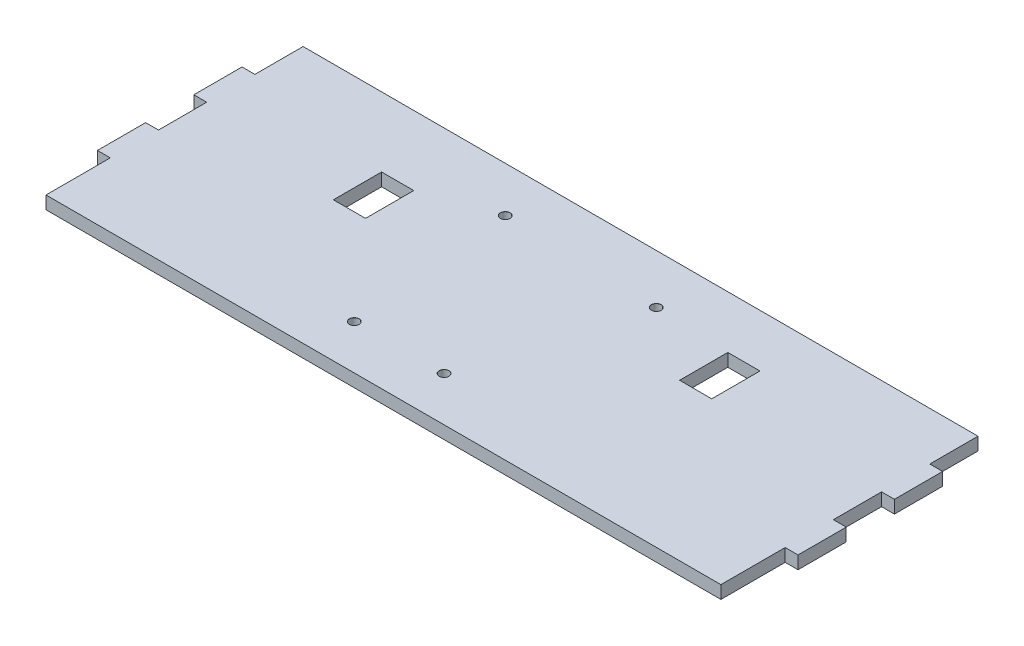
ISO-10303-21;
HEADER;
FILE_DESCRIPTION(('STEP AP214'),'2;1');
FILE_NAME('part.step','',(''),(''),'','','');
FILE_SCHEMA(('AUTOMOTIVE_DESIGN { 1 0 10303 214 1 1 1 1 }'));
ENDSEC;
DATA;
#1=APPLICATION_CONTEXT('core data for automotive mechanical design processes');
#2=APPLICATION_PROTOCOL_DEFINITION('international standard','automotive_design',2000,#1);
#3=PRODUCT_CONTEXT('',#1,'mechanical');
#4=PRODUCT('Part','Part','',(#3));
#5=PRODUCT_RELATED_PRODUCT_CATEGORY('part','',(#4));
#6=PRODUCT_DEFINITION_FORMATION('','',#4);
#7=PRODUCT_DEFINITION_CONTEXT('part definition',#1,'design');
#8=PRODUCT_DEFINITION('design','',#6,#7);
#9=PRODUCT_DEFINITION_SHAPE('','',#8);
#10=(LENGTH_UNIT() NAMED_UNIT(*) SI_UNIT(.MILLI.,.METRE.));
#11=(NAMED_UNIT(*) PLANE_ANGLE_UNIT() SI_UNIT($,.RADIAN.));
#12=(NAMED_UNIT(*) SI_UNIT($,.STERADIAN.) SOLID_ANGLE_UNIT());
#13=UNCERTAINTY_MEASURE_WITH_UNIT(LENGTH_MEASURE(1.E-05),#10,'distance_accuracy_value','');
#14=(GEOMETRIC_REPRESENTATION_CONTEXT(3) GLOBAL_UNCERTAINTY_ASSIGNED_CONTEXT((#13)) GLOBAL_UNIT_ASSIGNED_CONTEXT((#10,
#11,#12)) REPRESENTATION_CONTEXT('',''));
#15=CARTESIAN_POINT('',(0.,0.,0.));
#16=DIRECTION('',(0.,0.,1.));
#17=DIRECTION('',(1.,0.,0.));
#18=AXIS2_PLACEMENT_3D('',#15,#16,#17);
#19=CARTESIAN_POINT('',(210.,4.,0.));
#20=DIRECTION('',(-1.,0.,0.));
#21=DIRECTION('',(0.,0.,1.));
#22=AXIS2_PLACEMENT_3D('',#19,#20,#21);
#23=PLANE('',#22);
#24=DIRECTION('',(0.,1.,0.));
#25=VECTOR('',#24,1.);
#26=CARTESIAN_POINT('',(210.,3.99999999999979,-35.));
#27=LINE('',#26,#25);
#28=CARTESIAN_POINT('',(210.,-2.10173082171715E-13,-35.));
#29=VERTEX_POINT('',#28);
#30=CARTESIAN_POINT('',(210.,4.,-35.));
#31=VERTEX_POINT('',#30);
#32=EDGE_CURVE('E242',#29,#31,#27,.T.);
#33=ORIENTED_EDGE('',*,*,#32,.F.);
#34=DIRECTION('',(0.,0.,-1.));
#35=VECTOR('',#34,1.);
#36=CARTESIAN_POINT('',(210.,0.,0.));
#37=LINE('',#36,#35);
#38=CARTESIAN_POINT('',(210.,0.,-50.));
#39=VERTEX_POINT('',#38);
#40=EDGE_CURVE('E415',#29,#39,#37,.T.);
#41=ORIENTED_EDGE('',*,*,#40,.T.);
#42=DIRECTION('',(0.,-1.,0.));
#43=VECTOR('',#42,1.);
#44=CARTESIAN_POINT('',(210.,4.,-50.));
#45=LINE('',#44,#43);
#46=CARTESIAN_POINT('',(210.,4.,-50.));
#47=VERTEX_POINT('',#46);
#48=EDGE_CURVE('E246',#47,#39,#45,.T.);
#49=ORIENTED_EDGE('',*,*,#48,.F.);
#50=DIRECTION('',(0.,0.,-1.));
#51=VECTOR('',#50,1.);
#52=CARTESIAN_POINT('',(210.,4.,0.));
#53=LINE('',#52,#51);
#54=EDGE_CURVE('E48',#31,#47,#53,.T.);
#55=ORIENTED_EDGE('',*,*,#54,.F.);
#56=EDGE_LOOP('',(#33,#41,#49,#55));
#57=FACE_BOUND('',#56,.T.);
#58=ADVANCED_FACE('F33',(#57),#23,.F.);
#59=DIRECTION('',(0.,-1.,0.));
#60=VECTOR('',#59,1.);
#61=CARTESIAN_POINT('',(210.,3.99999999999979,-20.));
#62=LINE('',#61,#60);
#63=CARTESIAN_POINT('',(210.,4.,-20.));
#64=VERTEX_POINT('',#63);
#65=CARTESIAN_POINT('',(210.,0.,-20.));
#66=VERTEX_POINT('',#65);
#67=EDGE_CURVE('E56',#64,#66,#62,.T.);
#68=ORIENTED_EDGE('',*,*,#67,.F.);
#69=CARTESIAN_POINT('',(210.,4.,0.));
#70=VERTEX_POINT('',#69);
#71=EDGE_CURVE('E401',#70,#64,#53,.T.);
#72=ORIENTED_EDGE('',*,*,#71,.F.);
#73=DIRECTION('',(0.,-1.,0.));
#74=VECTOR('',#73,1.);
#75=CARTESIAN_POINT('',(210.,4.,0.));
#76=LINE('',#75,#74);
#77=CARTESIAN_POINT('',(210.,0.,0.));
#78=VERTEX_POINT('',#77);
#79=EDGE_CURVE('E41',#70,#78,#76,.T.);
#80=ORIENTED_EDGE('',*,*,#79,.T.);
#81=EDGE_CURVE('E412',#78,#66,#37,.T.);
#82=ORIENTED_EDGE('',*,*,#81,.T.);
#83=EDGE_LOOP('',(#68,#72,#80,#82));
#84=FACE_BOUND('',#83,.T.);
#85=ADVANCED_FACE('F424',(#84),#23,.F.);
#86=DIRECTION('',(0.,1.,0.));
#87=VECTOR('',#86,1.);
#88=CARTESIAN_POINT('',(210.,4.,-65.));
#89=LINE('',#88,#87);
#90=CARTESIAN_POINT('',(210.,0.,-65.));
#91=VERTEX_POINT('',#90);
#92=CARTESIAN_POINT('',(210.,4.,-65.));
#93=VERTEX_POINT('',#92);
#94=EDGE_CURVE('E243',#91,#93,#89,.T.);
#95=ORIENTED_EDGE('',*,*,#94,.F.);
#96=CARTESIAN_POINT('',(210.,0.,-80.));
#97=VERTEX_POINT('',#96);
#98=EDGE_CURVE('E411',#91,#97,#37,.T.);
#99=ORIENTED_EDGE('',*,*,#98,.T.);
#100=DIRECTION('',(0.,-1.,0.));
#101=VECTOR('',#100,1.);
#102=CARTESIAN_POINT('',(210.,4.,-80.));
#103=LINE('',#102,#101);
#104=CARTESIAN_POINT('',(210.,4.,-80.));
#105=VERTEX_POINT('',#104);
#106=EDGE_CURVE('E419',#105,#97,#103,.T.);
#107=ORIENTED_EDGE('',*,*,#106,.F.);
#108=EDGE_CURVE('E400',#93,#105,#53,.T.);
#109=ORIENTED_EDGE('',*,*,#108,.F.);
#110=EDGE_LOOP('',(#95,#99,#107,#109));
#111=FACE_BOUND('',#110,.T.);
#112=ADVANCED_FACE('F523',(#111),#23,.F.);
#113=CARTESIAN_POINT('',(0.,4.,0.));
#114=DIRECTION('',(1.,0.,0.));
#115=DIRECTION('',(0.,0.,-1.));
#116=AXIS2_PLACEMENT_3D('',#113,#114,#115);
#117=PLANE('',#116);
#118=DIRECTION('',(0.,-1.,0.));
#119=VECTOR('',#118,1.);
#120=CARTESIAN_POINT('',(0.,4.,-35.));
#121=LINE('',#120,#119);
#122=CARTESIAN_POINT('',(0.,4.,-35.));
#123=VERTEX_POINT('',#122);
#124=CARTESIAN_POINT('',(0.,0.,-35.));
#125=VERTEX_POINT('',#124);
#126=EDGE_CURVE('E275',#123,#125,#121,.T.);
#127=ORIENTED_EDGE('',*,*,#126,.F.);
#128=DIRECTION('',(0.,0.,1.));
#129=VECTOR('',#128,1.);
#130=CARTESIAN_POINT('',(0.,4.,0.));
#131=LINE('',#130,#129);
#132=CARTESIAN_POINT('',(0.,4.,-50.));
#133=VERTEX_POINT('',#132);
#134=EDGE_CURVE('E397',#133,#123,#131,.T.);
#135=ORIENTED_EDGE('',*,*,#134,.F.);
#136=DIRECTION('',(0.,1.,0.));
#137=VECTOR('',#136,1.);
#138=CARTESIAN_POINT('',(0.,4.,-50.));
#139=LINE('',#138,#137);
#140=CARTESIAN_POINT('',(0.,0.,-50.));
#141=VERTEX_POINT('',#140);
#142=EDGE_CURVE('E307',#141,#133,#139,.T.);
#143=ORIENTED_EDGE('',*,*,#142,.F.);
#144=DIRECTION('',(0.,0.,1.));
#145=VECTOR('',#144,1.);
#146=CARTESIAN_POINT('',(0.,0.,0.));
#147=LINE('',#146,#145);
#148=EDGE_CURVE('E409',#141,#125,#147,.T.);
#149=ORIENTED_EDGE('',*,*,#148,.T.);
#150=EDGE_LOOP('',(#127,#135,#143,#149));
#151=FACE_BOUND('',#150,.T.);
#152=ADVANCED_FACE('F528',(#151),#117,.F.);
#153=DIRECTION('',(0.,1.,0.));
#154=VECTOR('',#153,1.);
#155=CARTESIAN_POINT('',(0.,4.,-20.));
#156=LINE('',#155,#154);
#157=CARTESIAN_POINT('',(0.,0.,-20.));
#158=VERTEX_POINT('',#157);
#159=CARTESIAN_POINT('',(0.,4.,-20.));
#160=VERTEX_POINT('',#159);
#161=EDGE_CURVE('E280',#158,#160,#156,.T.);
#162=ORIENTED_EDGE('',*,*,#161,.F.);
#163=CARTESIAN_POINT('',(0.,0.,0.));
#164=VERTEX_POINT('',#163);
#165=EDGE_CURVE('E357',#158,#164,#147,.T.);
#166=ORIENTED_EDGE('',*,*,#165,.T.);
#167=DIRECTION('',(0.,-1.,0.));
#168=VECTOR('',#167,1.);
#169=CARTESIAN_POINT('',(0.,4.,0.));
#170=LINE('',#169,#168);
#171=CARTESIAN_POINT('',(0.,4.,0.));
#172=VERTEX_POINT('',#171);
#173=EDGE_CURVE('E11',#172,#164,#170,.T.);
#174=ORIENTED_EDGE('',*,*,#173,.F.);
#175=EDGE_CURVE('E398',#160,#172,#131,.T.);
#176=ORIENTED_EDGE('',*,*,#175,.F.);
#177=EDGE_LOOP('',(#162,#166,#174,#176));
#178=FACE_BOUND('',#177,.T.);
#179=ADVANCED_FACE('F533',(#178),#117,.F.);
#180=DIRECTION('',(0.,-1.,0.));
#181=VECTOR('',#180,1.);
#182=CARTESIAN_POINT('',(0.,4.,-65.));
#183=LINE('',#182,#181);
#184=CARTESIAN_POINT('',(0.,4.,-65.));
#185=VERTEX_POINT('',#184);
#186=CARTESIAN_POINT('',(0.,0.,-65.));
#187=VERTEX_POINT('',#186);
#188=EDGE_CURVE('E302',#185,#187,#183,.T.);
#189=ORIENTED_EDGE('',*,*,#188,.F.);
#190=CARTESIAN_POINT('',(0.,4.,-80.));
#191=VERTEX_POINT('',#190);
#192=EDGE_CURVE('E394',#191,#185,#131,.T.);
#193=ORIENTED_EDGE('',*,*,#192,.F.);
#194=DIRECTION('',(0.,-1.,0.));
#195=VECTOR('',#194,1.);
#196=CARTESIAN_POINT('',(0.,4.,-80.));
#197=LINE('',#196,#195);
#198=CARTESIAN_POINT('',(0.,0.,-80.));
#199=VERTEX_POINT('',#198);
#200=EDGE_CURVE('E405',#191,#199,#197,.T.);
#201=ORIENTED_EDGE('',*,*,#200,.T.);
#202=EDGE_CURVE('E406',#199,#187,#147,.T.);
#203=ORIENTED_EDGE('',*,*,#202,.T.);
#204=EDGE_LOOP('',(#189,#193,#201,#203));
#205=FACE_BOUND('',#204,.T.);
#206=ADVANCED_FACE('F35',(#205),#117,.F.);
#207=CARTESIAN_POINT('',(0.,4.,0.));
#208=DIRECTION('',(0.,0.,-1.));
#209=DIRECTION('',(-1.,0.,0.));
#210=AXIS2_PLACEMENT_3D('',#207,#208,#209);
#211=PLANE('',#210);
#212=DIRECTION('',(1.,0.,0.));
#213=VECTOR('',#212,1.);
#214=CARTESIAN_POINT('',(0.,0.,0.));
#215=LINE('',#214,#213);
#216=EDGE_CURVE('E408',#164,#78,#215,.T.);
#217=ORIENTED_EDGE('',*,*,#216,.T.);
#218=ORIENTED_EDGE('',*,*,#79,.F.);
#219=DIRECTION('',(1.,0.,0.));
#220=VECTOR('',#219,1.);
#221=CARTESIAN_POINT('',(0.,4.,0.));
#222=LINE('',#221,#220);
#223=EDGE_CURVE('E396',#172,#70,#222,.T.);
#224=ORIENTED_EDGE('',*,*,#223,.F.);
#225=ORIENTED_EDGE('',*,*,#173,.T.);
#226=EDGE_LOOP('',(#217,#218,#224,#225));
#227=FACE_BOUND('',#226,.T.);
#228=ADVANCED_FACE('F587',(#227),#211,.F.);
#229=CARTESIAN_POINT('',(0.,4.,-80.));
#230=DIRECTION('',(0.,0.,1.));
#231=DIRECTION('',(1.,0.,0.));
#232=AXIS2_PLACEMENT_3D('',#229,#230,#231);
#233=PLANE('',#232);
#234=DIRECTION('',(-1.,0.,0.));
#235=VECTOR('',#234,1.);
#236=CARTESIAN_POINT('',(0.,0.,-80.));
#237=LINE('',#236,#235);
#238=EDGE_CURVE('E414',#97,#199,#237,.T.);
#239=ORIENTED_EDGE('',*,*,#238,.T.);
#240=ORIENTED_EDGE('',*,*,#200,.F.);
#241=DIRECTION('',(-1.,0.,0.));
#242=VECTOR('',#241,1.);
#243=CARTESIAN_POINT('',(0.,4.,-80.));
#244=LINE('',#243,#242);
#245=EDGE_CURVE('E403',#105,#191,#244,.T.);
#246=ORIENTED_EDGE('',*,*,#245,.F.);
#247=ORIENTED_EDGE('',*,*,#106,.T.);
#248=EDGE_LOOP('',(#239,#240,#246,#247));
#249=FACE_BOUND('',#248,.T.);
#250=ADVANCED_FACE('F482',(#249),#233,.F.);
#251=CARTESIAN_POINT('',(0.,4.,0.));
#252=DIRECTION('',(0.,-1.,0.));
#253=DIRECTION('',(0.,0.,-1.));
#254=AXIS2_PLACEMENT_3D('',#251,#252,#253);
#255=PLANE('',#254);
#256=CARTESIAN_POINT('',(125.26524158489,4.,-64.631998291016));
#257=DIRECTION('',(0.,1.,0.));
#258=DIRECTION('',(0.,0.,1.));
#259=AXIS2_PLACEMENT_3D('',#256,#257,#258);
#260=CIRCLE('',#259,1.525);
#261=CARTESIAN_POINT('',(125.26524158489,4.,-63.106998291016));
#262=VERTEX_POINT('',#261);
#263=EDGE_CURVE('E474',#262,#262,#260,.T.);
#264=ORIENTED_EDGE('',*,*,#263,.F.);
#265=EDGE_LOOP('',(#264));
#266=FACE_BOUND('',#265,.T.);
#267=CARTESIAN_POINT('',(77.0052415848901,4.,-65.901998291016));
#268=DIRECTION('',(0.,1.,0.));
#269=DIRECTION('',(0.,0.,1.));
#270=AXIS2_PLACEMENT_3D('',#267,#268,#269);
#271=CIRCLE('',#270,1.525);
#272=CARTESIAN_POINT('',(77.0052415848901,4.,-64.376998291016));
#273=VERTEX_POINT('',#272);
#274=EDGE_CURVE('E465',#273,#273,#271,.T.);
#275=ORIENTED_EDGE('',*,*,#274,.F.);
#276=EDGE_LOOP('',(#275));
#277=FACE_BOUND('',#276,.T.);
#278=CARTESIAN_POINT('',(82.0852415848901,4.,-13.831998291016));
#279=DIRECTION('',(0.,1.,0.));
#280=DIRECTION('',(0.,0.,1.));
#281=AXIS2_PLACEMENT_3D('',#278,#279,#280);
#282=CIRCLE('',#281,1.525);
#283=CARTESIAN_POINT('',(82.0852415848901,4.,-12.306998291016));
#284=VERTEX_POINT('',#283);
#285=EDGE_CURVE('E456',#284,#284,#282,.T.);
#286=ORIENTED_EDGE('',*,*,#285,.F.);
#287=EDGE_LOOP('',(#286));
#288=FACE_BOUND('',#287,.T.);
#289=CARTESIAN_POINT('',(110.02524158489,4.,-13.831998291016));
#290=DIRECTION('',(0.,1.,0.));
#291=DIRECTION('',(0.,0.,1.));
#292=AXIS2_PLACEMENT_3D('',#289,#290,#291);
#293=CIRCLE('',#292,1.525);
#294=CARTESIAN_POINT('',(110.02524158489,4.,-12.306998291016));
#295=VERTEX_POINT('',#294);
#296=EDGE_CURVE('E447',#295,#295,#293,.T.);
#297=ORIENTED_EDGE('',*,*,#296,.F.);
#298=EDGE_LOOP('',(#297));
#299=FACE_BOUND('',#298,.T.);
#300=DIRECTION('',(-1.,0.,0.));
#301=VECTOR('',#300,1.);
#302=CARTESIAN_POINT('',(158.509116538983,4.,-63.641774946445));
#303=LINE('',#302,#301);
#304=CARTESIAN_POINT('',(158.509116538983,4.,-63.641774946445));
#305=VERTEX_POINT('',#304);
#306=CARTESIAN_POINT('',(148.509116538983,4.,-63.641774946445));
#307=VERTEX_POINT('',#306);
#308=EDGE_CURVE('E346',#305,#307,#303,.T.);
#309=ORIENTED_EDGE('',*,*,#308,.F.);
#310=DIRECTION('',(0.,0.,-1.));
#311=VECTOR('',#310,1.);
#312=CARTESIAN_POINT('',(158.509116538983,4.,-63.641774946445));
#313=LINE('',#312,#311);
#314=CARTESIAN_POINT('',(158.509116538983,4.,-48.641774946445));
#315=VERTEX_POINT('',#314);
#316=EDGE_CURVE('E344',#315,#305,#313,.T.);
#317=ORIENTED_EDGE('',*,*,#316,.F.);
#318=DIRECTION('',(1.,0.,0.));
#319=VECTOR('',#318,1.);
#320=CARTESIAN_POINT('',(158.509116538983,4.,-48.641774946445));
#321=LINE('',#320,#319);
#322=CARTESIAN_POINT('',(148.509116538983,4.,-48.641774946445));
#323=VERTEX_POINT('',#322);
#324=EDGE_CURVE('E334',#323,#315,#321,.T.);
#325=ORIENTED_EDGE('',*,*,#324,.F.);
#326=DIRECTION('',(0.,0.,1.));
#327=VECTOR('',#326,1.);
#328=CARTESIAN_POINT('',(148.509116538983,4.,-63.641774946445));
#329=LINE('',#328,#327);
#330=EDGE_CURVE('E350',#307,#323,#329,.T.);
#331=ORIENTED_EDGE('',*,*,#330,.F.);
#332=EDGE_LOOP('',(#309,#317,#325,#331));
#333=FACE_BOUND('',#332,.T.);
#334=DIRECTION('',(-1.,0.,0.));
#335=VECTOR('',#334,1.);
#336=CARTESIAN_POINT('',(56.0148371845039,4.,-58.4048605172355));
#337=LINE('',#336,#335);
#338=CARTESIAN_POINT('',(56.0148371845039,4.,-58.4048605172355));
#339=VERTEX_POINT('',#338);
#340=CARTESIAN_POINT('',(46.0148371845039,4.,-58.4048605172355));
#341=VERTEX_POINT('',#340);
#342=EDGE_CURVE('E379',#339,#341,#337,.T.);
#343=ORIENTED_EDGE('',*,*,#342,.F.);
#344=DIRECTION('',(0.,0.,-1.));
#345=VECTOR('',#344,1.);
#346=CARTESIAN_POINT('',(56.0148371845039,4.,-58.4048605172355));
#347=LINE('',#346,#345);
#348=CARTESIAN_POINT('',(56.0148371845039,4.,-43.4048605172355));
#349=VERTEX_POINT('',#348);
#350=EDGE_CURVE('E329',#349,#339,#347,.T.);
#351=ORIENTED_EDGE('',*,*,#350,.F.);
#352=DIRECTION('',(1.,0.,0.));
#353=VECTOR('',#352,1.);
#354=CARTESIAN_POINT('',(56.0148371845039,4.,-43.4048605172355));
#355=LINE('',#354,#353);
#356=CARTESIAN_POINT('',(46.0148371845039,4.,-43.4048605172355));
#357=VERTEX_POINT('',#356);
#358=EDGE_CURVE('E368',#357,#349,#355,.T.);
#359=ORIENTED_EDGE('',*,*,#358,.F.);
#360=DIRECTION('',(0.,0.,1.));
#361=VECTOR('',#360,1.);
#362=CARTESIAN_POINT('',(46.0148371845039,4.,-58.4048605172355));
#363=LINE('',#362,#361);
#364=EDGE_CURVE('E382',#341,#357,#363,.T.);
#365=ORIENTED_EDGE('',*,*,#364,.F.);
#366=EDGE_LOOP('',(#343,#351,#359,#365));
#367=FACE_BOUND('',#366,.T.);
#368=ORIENTED_EDGE('',*,*,#192,.T.);
#369=DIRECTION('',(1.,0.,0.));
#370=VECTOR('',#369,1.);
#371=CARTESIAN_POINT('',(-4.00000000000002,4.,-65.));
#372=LINE('',#371,#370);
#373=CARTESIAN_POINT('',(-4.00000000000002,4.,-65.));
#374=VERTEX_POINT('',#373);
#375=EDGE_CURVE('E313',#374,#185,#372,.T.);
#376=ORIENTED_EDGE('',*,*,#375,.F.);
#377=DIRECTION('',(0.,0.,-1.));
#378=VECTOR('',#377,1.);
#379=CARTESIAN_POINT('',(-4.00000000000002,4.,-65.));
#380=LINE('',#379,#378);
#381=CARTESIAN_POINT('',(-4.00000000000002,4.,-50.));
#382=VERTEX_POINT('',#381);
#383=EDGE_CURVE('E311',#382,#374,#380,.T.);
#384=ORIENTED_EDGE('',*,*,#383,.F.);
#385=DIRECTION('',(1.,0.,0.));
#386=VECTOR('',#385,1.);
#387=CARTESIAN_POINT('',(-4.00000000000002,4.,-50.));
#388=LINE('',#387,#386);
#389=EDGE_CURVE('E320',#382,#133,#388,.T.);
#390=ORIENTED_EDGE('',*,*,#389,.T.);
#391=ORIENTED_EDGE('',*,*,#134,.T.);
#392=DIRECTION('',(1.,0.,0.));
#393=VECTOR('',#392,1.);
#394=CARTESIAN_POINT('',(-4.00000000000001,4.,-35.));
#395=LINE('',#394,#393);
#396=CARTESIAN_POINT('',(-4.00000000000001,4.,-35.));
#397=VERTEX_POINT('',#396);
#398=EDGE_CURVE('E286',#397,#123,#395,.T.);
#399=ORIENTED_EDGE('',*,*,#398,.F.);
#400=DIRECTION('',(0.,0.,-1.));
#401=VECTOR('',#400,1.);
#402=CARTESIAN_POINT('',(-4.00000000000001,4.,-35.));
#403=LINE('',#402,#401);
#404=CARTESIAN_POINT('',(-4.00000000000001,4.,-20.));
#405=VERTEX_POINT('',#404);
#406=EDGE_CURVE('E284',#405,#397,#403,.T.);
#407=ORIENTED_EDGE('',*,*,#406,.F.);
#408=DIRECTION('',(1.,0.,0.));
#409=VECTOR('',#408,1.);
#410=CARTESIAN_POINT('',(-4.00000000000001,4.,-20.));
#411=LINE('',#410,#409);
#412=EDGE_CURVE('E293',#405,#160,#411,.T.);
#413=ORIENTED_EDGE('',*,*,#412,.T.);
#414=ORIENTED_EDGE('',*,*,#175,.T.);
#415=ORIENTED_EDGE('',*,*,#223,.T.);
#416=ORIENTED_EDGE('',*,*,#71,.T.);
#417=DIRECTION('',(-1.,0.,0.));
#418=VECTOR('',#417,1.);
#419=CARTESIAN_POINT('',(214.,3.99999999999979,-20.));
#420=LINE('',#419,#418);
#421=CARTESIAN_POINT('',(214.,3.99999999999979,-20.));
#422=VERTEX_POINT('',#421);
#423=EDGE_CURVE('E227',#422,#64,#420,.T.);
#424=ORIENTED_EDGE('',*,*,#423,.F.);
#425=DIRECTION('',(0.,0.,1.));
#426=VECTOR('',#425,1.);
#427=CARTESIAN_POINT('',(214.,3.99999999999979,-35.));
#428=LINE('',#427,#426);
#429=CARTESIAN_POINT('',(214.,3.99999999999979,-35.));
#430=VERTEX_POINT('',#429);
#431=EDGE_CURVE('E219',#430,#422,#428,.T.);
#432=ORIENTED_EDGE('',*,*,#431,.F.);
#433=DIRECTION('',(-1.,0.,0.));
#434=VECTOR('',#433,1.);
#435=CARTESIAN_POINT('',(214.,3.99999999999979,-35.));
#436=LINE('',#435,#434);
#437=EDGE_CURVE('E224',#430,#31,#436,.T.);
#438=ORIENTED_EDGE('',*,*,#437,.T.);
#439=ORIENTED_EDGE('',*,*,#54,.T.);
#440=DIRECTION('',(-1.,0.,0.));
#441=VECTOR('',#440,1.);
#442=CARTESIAN_POINT('',(214.,4.,-50.));
#443=LINE('',#442,#441);
#444=CARTESIAN_POINT('',(214.,4.,-50.));
#445=VERTEX_POINT('',#444);
#446=EDGE_CURVE('E269',#445,#47,#443,.T.);
#447=ORIENTED_EDGE('',*,*,#446,.F.);
#448=DIRECTION('',(0.,0.,1.));
#449=VECTOR('',#448,1.);
#450=CARTESIAN_POINT('',(214.,4.,-65.));
#451=LINE('',#450,#449);
#452=CARTESIAN_POINT('',(214.,4.,-65.));
#453=VERTEX_POINT('',#452);
#454=EDGE_CURVE('E255',#453,#445,#451,.T.);
#455=ORIENTED_EDGE('',*,*,#454,.F.);
#456=DIRECTION('',(-1.,0.,0.));
#457=VECTOR('',#456,1.);
#458=CARTESIAN_POINT('',(214.,4.,-65.));
#459=LINE('',#458,#457);
#460=EDGE_CURVE('E272',#453,#93,#459,.T.);
#461=ORIENTED_EDGE('',*,*,#460,.T.);
#462=ORIENTED_EDGE('',*,*,#108,.T.);
#463=ORIENTED_EDGE('',*,*,#245,.T.);
#464=EDGE_LOOP('',(#368,#376,#384,#390,#391,#399,#407,#413,#414,#415,#416,#424,#432,#438,#439,
#447,#455,#461,#462,#463));
#465=FACE_BOUND('',#464,.T.);
#466=ADVANCED_FACE('F222',(#266,#277,#288,#299,#333,#367,#465),#255,.F.);
#467=CARTESIAN_POINT('',(0.,0.,0.));
#468=DIRECTION('',(0.,-1.,0.));
#469=DIRECTION('',(0.,0.,-1.));
#470=AXIS2_PLACEMENT_3D('',#467,#468,#469);
#471=PLANE('',#470);
#472=CARTESIAN_POINT('',(125.26524158489,-2.09901540593194E-13,-64.631998291016));
#473=DIRECTION('',(0.,1.,0.));
#474=DIRECTION('',(0.,0.,1.));
#475=AXIS2_PLACEMENT_3D('',#472,#473,#474);
#476=CIRCLE('',#475,1.5);
#477=CARTESIAN_POINT('',(125.26524158489,-2.09901540593194E-13,-63.131998291016));
#478=VERTEX_POINT('',#477);
#479=EDGE_CURVE('E468',#478,#478,#476,.T.);
#480=ORIENTED_EDGE('',*,*,#479,.T.);
#481=EDGE_LOOP('',(#480));
#482=FACE_BOUND('',#481,.T.);
#483=CARTESIAN_POINT('',(77.0052415848901,-2.09901540593194E-13,-65.901998291016));
#484=DIRECTION('',(0.,1.,0.));
#485=DIRECTION('',(0.,0.,1.));
#486=AXIS2_PLACEMENT_3D('',#483,#484,#485);
#487=CIRCLE('',#486,1.5);
#488=CARTESIAN_POINT('',(77.0052415848901,-2.09901540593194E-13,-64.401998291016));
#489=VERTEX_POINT('',#488);
#490=EDGE_CURVE('E459',#489,#489,#487,.T.);
#491=ORIENTED_EDGE('',*,*,#490,.T.);
#492=EDGE_LOOP('',(#491));
#493=FACE_BOUND('',#492,.T.);
#494=CARTESIAN_POINT('',(82.0852415848901,-2.09901540593194E-13,-13.831998291016));
#495=DIRECTION('',(0.,1.,0.));
#496=DIRECTION('',(0.,0.,1.));
#497=AXIS2_PLACEMENT_3D('',#494,#495,#496);
#498=CIRCLE('',#497,1.5);
#499=CARTESIAN_POINT('',(82.0852415848901,-2.09901540593194E-13,-12.331998291016));
#500=VERTEX_POINT('',#499);
#501=EDGE_CURVE('E450',#500,#500,#498,.T.);
#502=ORIENTED_EDGE('',*,*,#501,.T.);
#503=EDGE_LOOP('',(#502));
#504=FACE_BOUND('',#503,.T.);
#505=CARTESIAN_POINT('',(110.02524158489,-2.09901540593194E-13,-13.831998291016));
#506=DIRECTION('',(0.,1.,0.));
#507=DIRECTION('',(0.,0.,1.));
#508=AXIS2_PLACEMENT_3D('',#505,#506,#507);
#509=CIRCLE('',#508,1.5);
#510=CARTESIAN_POINT('',(110.02524158489,-2.09901540593194E-13,-12.331998291016));
#511=VERTEX_POINT('',#510);
#512=EDGE_CURVE('E439',#511,#511,#509,.T.);
#513=ORIENTED_EDGE('',*,*,#512,.T.);
#514=EDGE_LOOP('',(#513));
#515=FACE_BOUND('',#514,.T.);
#516=DIRECTION('',(0.,0.,-1.));
#517=VECTOR('',#516,1.);
#518=CARTESIAN_POINT('',(158.509116538983,0.,-63.641774946445));
#519=LINE('',#518,#517);
#520=CARTESIAN_POINT('',(158.509116538983,0.,-48.641774946445));
#521=VERTEX_POINT('',#520);
#522=CARTESIAN_POINT('',(158.509116538983,0.,-63.641774946445));
#523=VERTEX_POINT('',#522);
#524=EDGE_CURVE('E330',#521,#523,#519,.T.);
#525=ORIENTED_EDGE('',*,*,#524,.T.);
#526=DIRECTION('',(-1.,0.,0.));
#527=VECTOR('',#526,1.);
#528=CARTESIAN_POINT('',(158.509116538983,0.,-63.641774946445));
#529=LINE('',#528,#527);
#530=CARTESIAN_POINT('',(148.509116538983,0.,-63.641774946445));
#531=VERTEX_POINT('',#530);
#532=EDGE_CURVE('E333',#523,#531,#529,.T.);
#533=ORIENTED_EDGE('',*,*,#532,.T.);
#534=DIRECTION('',(0.,0.,1.));
#535=VECTOR('',#534,1.);
#536=CARTESIAN_POINT('',(148.509116538983,0.,-63.641774946445));
#537=LINE('',#536,#535);
#538=CARTESIAN_POINT('',(148.509116538983,0.,-48.641774946445));
#539=VERTEX_POINT('',#538);
#540=EDGE_CURVE('E337',#531,#539,#537,.T.);
#541=ORIENTED_EDGE('',*,*,#540,.T.);
#542=DIRECTION('',(1.,0.,0.));
#543=VECTOR('',#542,1.);
#544=CARTESIAN_POINT('',(158.509116538983,0.,-48.641774946445));
#545=LINE('',#544,#543);
#546=EDGE_CURVE('E340',#539,#521,#545,.T.);
#547=ORIENTED_EDGE('',*,*,#546,.T.);
#548=EDGE_LOOP('',(#525,#533,#541,#547));
#549=FACE_BOUND('',#548,.T.);
#550=DIRECTION('',(0.,0.,-1.));
#551=VECTOR('',#550,1.);
#552=CARTESIAN_POINT('',(56.0148371845039,0.,-58.4048605172355));
#553=LINE('',#552,#551);
#554=CARTESIAN_POINT('',(56.0148371845039,0.,-43.4048605172355));
#555=VERTEX_POINT('',#554);
#556=CARTESIAN_POINT('',(56.0148371845039,0.,-58.4048605172355));
#557=VERTEX_POINT('',#556);
#558=EDGE_CURVE('E364',#555,#557,#553,.T.);
#559=ORIENTED_EDGE('',*,*,#558,.T.);
#560=DIRECTION('',(-1.,0.,0.));
#561=VECTOR('',#560,1.);
#562=CARTESIAN_POINT('',(56.0148371845039,0.,-58.4048605172355));
#563=LINE('',#562,#561);
#564=CARTESIAN_POINT('',(46.0148371845039,0.,-58.4048605172355));
#565=VERTEX_POINT('',#564);
#566=EDGE_CURVE('E367',#557,#565,#563,.T.);
#567=ORIENTED_EDGE('',*,*,#566,.T.);
#568=DIRECTION('',(0.,0.,1.));
#569=VECTOR('',#568,1.);
#570=CARTESIAN_POINT('',(46.0148371845039,0.,-58.4048605172355));
#571=LINE('',#570,#569);
#572=CARTESIAN_POINT('',(46.0148371845039,0.,-43.4048605172355));
#573=VERTEX_POINT('',#572);
#574=EDGE_CURVE('E371',#565,#573,#571,.T.);
#575=ORIENTED_EDGE('',*,*,#574,.T.);
#576=DIRECTION('',(1.,0.,0.));
#577=VECTOR('',#576,1.);
#578=CARTESIAN_POINT('',(56.0148371845039,0.,-43.4048605172355));
#579=LINE('',#578,#577);
#580=EDGE_CURVE('E374',#573,#555,#579,.T.);
#581=ORIENTED_EDGE('',*,*,#580,.T.);
#582=EDGE_LOOP('',(#559,#567,#575,#581));
#583=FACE_BOUND('',#582,.T.);
#584=ORIENTED_EDGE('',*,*,#202,.F.);
#585=ORIENTED_EDGE('',*,*,#238,.F.);
#586=ORIENTED_EDGE('',*,*,#98,.F.);
#587=DIRECTION('',(-1.,0.,0.));
#588=VECTOR('',#587,1.);
#589=CARTESIAN_POINT('',(214.,0.,-65.));
#590=LINE('',#589,#588);
#591=CARTESIAN_POINT('',(214.,0.,-65.));
#592=VERTEX_POINT('',#591);
#593=EDGE_CURVE('E260',#592,#91,#590,.T.);
#594=ORIENTED_EDGE('',*,*,#593,.F.);
#595=DIRECTION('',(0.,0.,-1.));
#596=VECTOR('',#595,1.);
#597=CARTESIAN_POINT('',(214.,0.,-65.));
#598=LINE('',#597,#596);
#599=CARTESIAN_POINT('',(214.,0.,-50.));
#600=VERTEX_POINT('',#599);
#601=EDGE_CURVE('E259',#600,#592,#598,.T.);
#602=ORIENTED_EDGE('',*,*,#601,.F.);
#603=DIRECTION('',(-1.,0.,0.));
#604=VECTOR('',#603,1.);
#605=CARTESIAN_POINT('',(214.,0.,-50.));
#606=LINE('',#605,#604);
#607=EDGE_CURVE('E266',#600,#39,#606,.T.);
#608=ORIENTED_EDGE('',*,*,#607,.T.);
#609=ORIENTED_EDGE('',*,*,#40,.F.);
#610=DIRECTION('',(-1.,0.,0.));
#611=VECTOR('',#610,1.);
#612=CARTESIAN_POINT('',(214.,-2.10173082171715E-13,-35.));
#613=LINE('',#612,#611);
#614=CARTESIAN_POINT('',(214.,-2.10173082171715E-13,-35.));
#615=VERTEX_POINT('',#614);
#616=EDGE_CURVE('E434',#615,#29,#613,.T.);
#617=ORIENTED_EDGE('',*,*,#616,.F.);
#618=DIRECTION('',(0.,0.,-1.));
#619=VECTOR('',#618,1.);
#620=CARTESIAN_POINT('',(214.,-2.10173082171715E-13,-35.));
#621=LINE('',#620,#619);
#622=CARTESIAN_POINT('',(214.,-2.09488880330588E-13,-20.));
#623=VERTEX_POINT('',#622);
#624=EDGE_CURVE('E236',#623,#615,#621,.T.);
#625=ORIENTED_EDGE('',*,*,#624,.F.);
#626=DIRECTION('',(-1.,0.,0.));
#627=VECTOR('',#626,1.);
#628=CARTESIAN_POINT('',(214.,-2.09488880330588E-13,-20.));
#629=LINE('',#628,#627);
#630=EDGE_CURVE('E248',#623,#66,#629,.T.);
#631=ORIENTED_EDGE('',*,*,#630,.T.);
#632=ORIENTED_EDGE('',*,*,#81,.F.);
#633=ORIENTED_EDGE('',*,*,#216,.F.);
#634=ORIENTED_EDGE('',*,*,#165,.F.);
#635=DIRECTION('',(1.,0.,0.));
#636=VECTOR('',#635,1.);
#637=CARTESIAN_POINT('',(-4.00000000000001,0.,-20.));
#638=LINE('',#637,#636);
#639=CARTESIAN_POINT('',(-4.00000000000001,0.,-20.));
#640=VERTEX_POINT('',#639);
#641=EDGE_CURVE('E296',#640,#158,#638,.T.);
#642=ORIENTED_EDGE('',*,*,#641,.F.);
#643=DIRECTION('',(0.,0.,1.));
#644=VECTOR('',#643,1.);
#645=CARTESIAN_POINT('',(-4.00000000000001,0.,-35.));
#646=LINE('',#645,#644);
#647=CARTESIAN_POINT('',(-4.00000000000001,0.,-35.));
#648=VERTEX_POINT('',#647);
#649=EDGE_CURVE('E279',#648,#640,#646,.T.);
#650=ORIENTED_EDGE('',*,*,#649,.F.);
#651=DIRECTION('',(1.,0.,0.));
#652=VECTOR('',#651,1.);
#653=CARTESIAN_POINT('',(-4.00000000000001,0.,-35.));
#654=LINE('',#653,#652);
#655=EDGE_CURVE('E299',#648,#125,#654,.T.);
#656=ORIENTED_EDGE('',*,*,#655,.T.);
#657=ORIENTED_EDGE('',*,*,#148,.F.);
#658=DIRECTION('',(1.,0.,0.));
#659=VECTOR('',#658,1.);
#660=CARTESIAN_POINT('',(-4.00000000000002,0.,-50.));
#661=LINE('',#660,#659);
#662=CARTESIAN_POINT('',(-4.00000000000002,0.,-50.));
#663=VERTEX_POINT('',#662);
#664=EDGE_CURVE('E323',#663,#141,#661,.T.);
#665=ORIENTED_EDGE('',*,*,#664,.F.);
#666=DIRECTION('',(0.,0.,1.));
#667=VECTOR('',#666,1.);
#668=CARTESIAN_POINT('',(-4.00000000000002,0.,-65.));
#669=LINE('',#668,#667);
#670=CARTESIAN_POINT('',(-4.00000000000002,0.,-65.));
#671=VERTEX_POINT('',#670);
#672=EDGE_CURVE('E306',#671,#663,#669,.T.);
#673=ORIENTED_EDGE('',*,*,#672,.F.);
#674=DIRECTION('',(1.,0.,0.));
#675=VECTOR('',#674,1.);
#676=CARTESIAN_POINT('',(-4.00000000000002,0.,-65.));
#677=LINE('',#676,#675);
#678=EDGE_CURVE('E326',#671,#187,#677,.T.);
#679=ORIENTED_EDGE('',*,*,#678,.T.);
#680=EDGE_LOOP('',(#584,#585,#586,#594,#602,#608,#609,#617,#625,#631,#632,#633,#634,#642,#650,
#656,#657,#665,#673,#679));
#681=FACE_BOUND('',#680,.T.);
#682=ADVANCED_FACE('F431',(#482,#493,#504,#515,#549,#583,#681),#471,.T.);
#683=CARTESIAN_POINT('',(56.0148371845039,0.,-58.4048605172355));
#684=DIRECTION('',(1.,0.,0.));
#685=DIRECTION('',(0.,0.,-1.));
#686=AXIS2_PLACEMENT_3D('',#683,#684,#685);
#687=PLANE('',#686);
#688=ORIENTED_EDGE('',*,*,#350,.T.);
#689=DIRECTION('',(0.,1.,0.));
#690=VECTOR('',#689,1.);
#691=CARTESIAN_POINT('',(56.0148371845039,0.,-58.4048605172355));
#692=LINE('',#691,#690);
#693=EDGE_CURVE('E377',#557,#339,#692,.T.);
#694=ORIENTED_EDGE('',*,*,#693,.F.);
#695=ORIENTED_EDGE('',*,*,#558,.F.);
#696=DIRECTION('',(0.,1.,0.));
#697=VECTOR('',#696,1.);
#698=CARTESIAN_POINT('',(56.0148371845039,0.,-43.4048605172355));
#699=LINE('',#698,#697);
#700=EDGE_CURVE('E347',#555,#349,#699,.T.);
#701=ORIENTED_EDGE('',*,*,#700,.T.);
#702=EDGE_LOOP('',(#688,#694,#695,#701));
#703=FACE_BOUND('',#702,.T.);
#704=ADVANCED_FACE('F504',(#703),#687,.F.);
#705=CARTESIAN_POINT('',(56.0148371845039,0.,-43.4048605172355));
#706=DIRECTION('',(0.,0.,1.));
#707=DIRECTION('',(1.,0.,0.));
#708=AXIS2_PLACEMENT_3D('',#705,#706,#707);
#709=PLANE('',#708);
#710=ORIENTED_EDGE('',*,*,#358,.T.);
#711=ORIENTED_EDGE('',*,*,#700,.F.);
#712=ORIENTED_EDGE('',*,*,#580,.F.);
#713=DIRECTION('',(0.,1.,0.));
#714=VECTOR('',#713,1.);
#715=CARTESIAN_POINT('',(46.0148371845039,0.,-43.4048605172355));
#716=LINE('',#715,#714);
#717=EDGE_CURVE('E388',#573,#357,#716,.T.);
#718=ORIENTED_EDGE('',*,*,#717,.T.);
#719=EDGE_LOOP('',(#710,#711,#712,#718));
#720=FACE_BOUND('',#719,.T.);
#721=ADVANCED_FACE('F507',(#720),#709,.F.);
#722=CARTESIAN_POINT('',(46.0148371845039,0.,-58.4048605172355));
#723=DIRECTION('',(-1.,0.,0.));
#724=DIRECTION('',(0.,0.,1.));
#725=AXIS2_PLACEMENT_3D('',#722,#723,#724);
#726=PLANE('',#725);
#727=ORIENTED_EDGE('',*,*,#364,.T.);
#728=ORIENTED_EDGE('',*,*,#717,.F.);
#729=ORIENTED_EDGE('',*,*,#574,.F.);
#730=DIRECTION('',(0.,1.,0.));
#731=VECTOR('',#730,1.);
#732=CARTESIAN_POINT('',(46.0148371845039,0.,-58.4048605172355));
#733=LINE('',#732,#731);
#734=EDGE_CURVE('E390',#565,#341,#733,.T.);
#735=ORIENTED_EDGE('',*,*,#734,.T.);
#736=EDGE_LOOP('',(#727,#728,#729,#735));
#737=FACE_BOUND('',#736,.T.);
#738=ADVANCED_FACE('F509',(#737),#726,.F.);
#739=CARTESIAN_POINT('',(56.0148371845039,0.,-58.4048605172355));
#740=DIRECTION('',(0.,0.,-1.));
#741=DIRECTION('',(-1.,0.,0.));
#742=AXIS2_PLACEMENT_3D('',#739,#740,#741);
#743=PLANE('',#742);
#744=ORIENTED_EDGE('',*,*,#342,.T.);
#745=ORIENTED_EDGE('',*,*,#734,.F.);
#746=ORIENTED_EDGE('',*,*,#566,.F.);
#747=ORIENTED_EDGE('',*,*,#693,.T.);
#748=EDGE_LOOP('',(#744,#745,#746,#747));
#749=FACE_BOUND('',#748,.T.);
#750=ADVANCED_FACE('F500',(#749),#743,.F.);
#751=CARTESIAN_POINT('',(158.509116538983,0.,-63.641774946445));
#752=DIRECTION('',(1.,0.,0.));
#753=DIRECTION('',(0.,0.,-1.));
#754=AXIS2_PLACEMENT_3D('',#751,#752,#753);
#755=PLANE('',#754);
#756=ORIENTED_EDGE('',*,*,#316,.T.);
#757=DIRECTION('',(0.,1.,0.));
#758=VECTOR('',#757,1.);
#759=CARTESIAN_POINT('',(158.509116538983,0.,-63.641774946445));
#760=LINE('',#759,#758);
#761=EDGE_CURVE('E343',#523,#305,#760,.T.);
#762=ORIENTED_EDGE('',*,*,#761,.F.);
#763=ORIENTED_EDGE('',*,*,#524,.F.);
#764=DIRECTION('',(0.,1.,0.));
#765=VECTOR('',#764,1.);
#766=CARTESIAN_POINT('',(158.509116538983,0.,-48.641774946445));
#767=LINE('',#766,#765);
#768=EDGE_CURVE('E355',#521,#315,#767,.T.);
#769=ORIENTED_EDGE('',*,*,#768,.T.);
#770=EDGE_LOOP('',(#756,#762,#763,#769));
#771=FACE_BOUND('',#770,.T.);
#772=ADVANCED_FACE('F635',(#771),#755,.F.);
#773=CARTESIAN_POINT('',(158.509116538983,0.,-48.641774946445));
#774=DIRECTION('',(0.,0.,1.));
#775=DIRECTION('',(1.,0.,0.));
#776=AXIS2_PLACEMENT_3D('',#773,#774,#775);
#777=PLANE('',#776);
#778=ORIENTED_EDGE('',*,*,#324,.T.);
#779=ORIENTED_EDGE('',*,*,#768,.F.);
#780=ORIENTED_EDGE('',*,*,#546,.F.);
#781=DIRECTION('',(0.,1.,0.));
#782=VECTOR('',#781,1.);
#783=CARTESIAN_POINT('',(148.509116538983,0.,-48.641774946445));
#784=LINE('',#783,#782);
#785=EDGE_CURVE('E358',#539,#323,#784,.T.);
#786=ORIENTED_EDGE('',*,*,#785,.T.);
#787=EDGE_LOOP('',(#778,#779,#780,#786));
#788=FACE_BOUND('',#787,.T.);
#789=ADVANCED_FACE('F625',(#788),#777,.F.);
#790=CARTESIAN_POINT('',(148.509116538983,0.,-63.641774946445));
#791=DIRECTION('',(-1.,0.,0.));
#792=DIRECTION('',(0.,0.,1.));
#793=AXIS2_PLACEMENT_3D('',#790,#791,#792);
#794=PLANE('',#793);
#795=ORIENTED_EDGE('',*,*,#330,.T.);
#796=ORIENTED_EDGE('',*,*,#785,.F.);
#797=ORIENTED_EDGE('',*,*,#540,.F.);
#798=DIRECTION('',(0.,1.,0.));
#799=VECTOR('',#798,1.);
#800=CARTESIAN_POINT('',(148.509116538983,0.,-63.641774946445));
#801=LINE('',#800,#799);
#802=EDGE_CURVE('E360',#531,#307,#801,.T.);
#803=ORIENTED_EDGE('',*,*,#802,.T.);
#804=EDGE_LOOP('',(#795,#796,#797,#803));
#805=FACE_BOUND('',#804,.T.);
#806=ADVANCED_FACE('F613',(#805),#794,.F.);
#807=CARTESIAN_POINT('',(158.509116538983,0.,-63.641774946445));
#808=DIRECTION('',(0.,0.,-1.));
#809=DIRECTION('',(-1.,0.,0.));
#810=AXIS2_PLACEMENT_3D('',#807,#808,#809);
#811=PLANE('',#810);
#812=ORIENTED_EDGE('',*,*,#308,.T.);
#813=ORIENTED_EDGE('',*,*,#802,.F.);
#814=ORIENTED_EDGE('',*,*,#532,.F.);
#815=ORIENTED_EDGE('',*,*,#761,.T.);
#816=EDGE_LOOP('',(#812,#813,#814,#815));
#817=FACE_BOUND('',#816,.T.);
#818=ADVANCED_FACE('F608',(#817),#811,.F.);
#819=CARTESIAN_POINT('',(-4.00000000000002,4.,-65.));
#820=DIRECTION('',(0.,0.,1.));
#821=DIRECTION('',(1.,0.,0.));
#822=AXIS2_PLACEMENT_3D('',#819,#820,#821);
#823=PLANE('',#822);
#824=ORIENTED_EDGE('',*,*,#188,.T.);
#825=ORIENTED_EDGE('',*,*,#678,.F.);
#826=DIRECTION('',(0.,-1.,0.));
#827=VECTOR('',#826,1.);
#828=CARTESIAN_POINT('',(-4.00000000000002,4.,-65.));
#829=LINE('',#828,#827);
#830=EDGE_CURVE('E303',#374,#671,#829,.T.);
#831=ORIENTED_EDGE('',*,*,#830,.F.);
#832=ORIENTED_EDGE('',*,*,#375,.T.);
#833=EDGE_LOOP('',(#824,#825,#831,#832));
#834=FACE_BOUND('',#833,.T.);
#835=ADVANCED_FACE('F560',(#834),#823,.F.);
#836=CARTESIAN_POINT('',(-4.00000000000002,4.,-50.));
#837=DIRECTION('',(0.,0.,-1.));
#838=DIRECTION('',(-1.,0.,0.));
#839=AXIS2_PLACEMENT_3D('',#836,#837,#838);
#840=PLANE('',#839);
#841=ORIENTED_EDGE('',*,*,#142,.T.);
#842=ORIENTED_EDGE('',*,*,#389,.F.);
#843=DIRECTION('',(0.,1.,0.));
#844=VECTOR('',#843,1.);
#845=CARTESIAN_POINT('',(-4.00000000000002,4.,-50.));
#846=LINE('',#845,#844);
#847=EDGE_CURVE('E309',#663,#382,#846,.T.);
#848=ORIENTED_EDGE('',*,*,#847,.F.);
#849=ORIENTED_EDGE('',*,*,#664,.T.);
#850=EDGE_LOOP('',(#841,#842,#848,#849));
#851=FACE_BOUND('',#850,.T.);
#852=ADVANCED_FACE('F570',(#851),#840,.F.);
#853=CARTESIAN_POINT('',(-4.,0.,0.));
#854=DIRECTION('',(-1.,0.,0.));
#855=DIRECTION('',(0.,0.,1.));
#856=AXIS2_PLACEMENT_3D('',#853,#854,#855);
#857=PLANE('',#856);
#858=ORIENTED_EDGE('',*,*,#830,.T.);
#859=ORIENTED_EDGE('',*,*,#672,.T.);
#860=ORIENTED_EDGE('',*,*,#847,.T.);
#861=ORIENTED_EDGE('',*,*,#383,.T.);
#862=EDGE_LOOP('',(#858,#859,#860,#861));
#863=FACE_BOUND('',#862,.T.);
#864=ADVANCED_FACE('F563',(#863),#857,.T.);
#865=CARTESIAN_POINT('',(-4.00000000000001,4.,-35.));
#866=DIRECTION('',(0.,0.,1.));
#867=DIRECTION('',(1.,0.,0.));
#868=AXIS2_PLACEMENT_3D('',#865,#866,#867);
#869=PLANE('',#868);
#870=ORIENTED_EDGE('',*,*,#126,.T.);
#871=ORIENTED_EDGE('',*,*,#655,.F.);
#872=DIRECTION('',(0.,-1.,0.));
#873=VECTOR('',#872,1.);
#874=CARTESIAN_POINT('',(-4.00000000000001,4.,-35.));
#875=LINE('',#874,#873);
#876=EDGE_CURVE('E276',#397,#648,#875,.T.);
#877=ORIENTED_EDGE('',*,*,#876,.F.);
#878=ORIENTED_EDGE('',*,*,#398,.T.);
#879=EDGE_LOOP('',(#870,#871,#877,#878));
#880=FACE_BOUND('',#879,.T.);
#881=ADVANCED_FACE('F586',(#880),#869,.F.);
#882=CARTESIAN_POINT('',(-4.00000000000001,4.,-20.));
#883=DIRECTION('',(0.,0.,-1.));
#884=DIRECTION('',(-1.,0.,0.));
#885=AXIS2_PLACEMENT_3D('',#882,#883,#884);
#886=PLANE('',#885);
#887=ORIENTED_EDGE('',*,*,#161,.T.);
#888=ORIENTED_EDGE('',*,*,#412,.F.);
#889=DIRECTION('',(0.,1.,0.));
#890=VECTOR('',#889,1.);
#891=CARTESIAN_POINT('',(-4.00000000000001,4.,-20.));
#892=LINE('',#891,#890);
#893=EDGE_CURVE('E282',#640,#405,#892,.T.);
#894=ORIENTED_EDGE('',*,*,#893,.F.);
#895=ORIENTED_EDGE('',*,*,#641,.T.);
#896=EDGE_LOOP('',(#887,#888,#894,#895));
#897=FACE_BOUND('',#896,.T.);
#898=ADVANCED_FACE('F580',(#897),#886,.F.);
#899=CARTESIAN_POINT('',(-4.,0.,0.));
#900=DIRECTION('',(-1.,0.,0.));
#901=DIRECTION('',(0.,0.,1.));
#902=AXIS2_PLACEMENT_3D('',#899,#900,#901);
#903=PLANE('',#902);
#904=ORIENTED_EDGE('',*,*,#876,.T.);
#905=ORIENTED_EDGE('',*,*,#649,.T.);
#906=ORIENTED_EDGE('',*,*,#893,.T.);
#907=ORIENTED_EDGE('',*,*,#406,.T.);
#908=EDGE_LOOP('',(#904,#905,#906,#907));
#909=FACE_BOUND('',#908,.T.);
#910=ADVANCED_FACE('F583',(#909),#903,.T.);
#911=CARTESIAN_POINT('',(214.,4.,-65.));
#912=DIRECTION('',(0.,0.,1.));
#913=DIRECTION('',(1.,0.,0.));
#914=AXIS2_PLACEMENT_3D('',#911,#912,#913);
#915=PLANE('',#914);
#916=ORIENTED_EDGE('',*,*,#94,.T.);
#917=ORIENTED_EDGE('',*,*,#460,.F.);
#918=DIRECTION('',(0.,1.,0.));
#919=VECTOR('',#918,1.);
#920=CARTESIAN_POINT('',(214.,4.,-65.));
#921=LINE('',#920,#919);
#922=EDGE_CURVE('E252',#592,#453,#921,.T.);
#923=ORIENTED_EDGE('',*,*,#922,.F.);
#924=ORIENTED_EDGE('',*,*,#593,.T.);
#925=EDGE_LOOP('',(#916,#917,#923,#924));
#926=FACE_BOUND('',#925,.T.);
#927=ADVANCED_FACE('F543',(#926),#915,.F.);
#928=CARTESIAN_POINT('',(214.,4.,-50.));
#929=DIRECTION('',(0.,0.,-1.));
#930=DIRECTION('',(-1.,0.,0.));
#931=AXIS2_PLACEMENT_3D('',#928,#929,#930);
#932=PLANE('',#931);
#933=ORIENTED_EDGE('',*,*,#48,.T.);
#934=ORIENTED_EDGE('',*,*,#607,.F.);
#935=DIRECTION('',(0.,-1.,0.));
#936=VECTOR('',#935,1.);
#937=CARTESIAN_POINT('',(214.,4.,-50.));
#938=LINE('',#937,#936);
#939=EDGE_CURVE('E257',#445,#600,#938,.T.);
#940=ORIENTED_EDGE('',*,*,#939,.F.);
#941=ORIENTED_EDGE('',*,*,#446,.T.);
#942=EDGE_LOOP('',(#933,#934,#940,#941));
#943=FACE_BOUND('',#942,.T.);
#944=ADVANCED_FACE('F550',(#943),#932,.F.);
#945=CARTESIAN_POINT('',(214.,0.,0.));
#946=DIRECTION('',(-1.,0.,0.));
#947=DIRECTION('',(0.,0.,1.));
#948=AXIS2_PLACEMENT_3D('',#945,#946,#947);
#949=PLANE('',#948);
#950=ORIENTED_EDGE('',*,*,#922,.T.);
#951=ORIENTED_EDGE('',*,*,#454,.T.);
#952=ORIENTED_EDGE('',*,*,#939,.T.);
#953=ORIENTED_EDGE('',*,*,#601,.T.);
#954=EDGE_LOOP('',(#950,#951,#952,#953));
#955=FACE_BOUND('',#954,.T.);
#956=ADVANCED_FACE('F545',(#955),#949,.F.);
#957=CARTESIAN_POINT('',(214.,3.99999999999979,-35.));
#958=DIRECTION('',(0.,0.,1.));
#959=DIRECTION('',(1.,0.,0.));
#960=AXIS2_PLACEMENT_3D('',#957,#958,#959);
#961=PLANE('',#960);
#962=ORIENTED_EDGE('',*,*,#32,.T.);
#963=ORIENTED_EDGE('',*,*,#437,.F.);
#964=DIRECTION('',(0.,1.,0.));
#965=VECTOR('',#964,1.);
#966=CARTESIAN_POINT('',(214.,3.99999999999979,-35.));
#967=LINE('',#966,#965);
#968=EDGE_CURVE('E231',#615,#430,#967,.T.);
#969=ORIENTED_EDGE('',*,*,#968,.F.);
#970=ORIENTED_EDGE('',*,*,#616,.T.);
#971=EDGE_LOOP('',(#962,#963,#969,#970));
#972=FACE_BOUND('',#971,.T.);
#973=ADVANCED_FACE('F241',(#972),#961,.F.);
#974=CARTESIAN_POINT('',(214.,3.99999999999979,-20.));
#975=DIRECTION('',(0.,0.,-1.));
#976=DIRECTION('',(-1.,0.,0.));
#977=AXIS2_PLACEMENT_3D('',#974,#975,#976);
#978=PLANE('',#977);
#979=ORIENTED_EDGE('',*,*,#67,.T.);
#980=ORIENTED_EDGE('',*,*,#630,.F.);
#981=DIRECTION('',(0.,-1.,0.));
#982=VECTOR('',#981,1.);
#983=CARTESIAN_POINT('',(214.,3.99999999999979,-20.));
#984=LINE('',#983,#982);
#985=EDGE_CURVE('E230',#422,#623,#984,.T.);
#986=ORIENTED_EDGE('',*,*,#985,.F.);
#987=ORIENTED_EDGE('',*,*,#423,.T.);
#988=EDGE_LOOP('',(#979,#980,#986,#987));
#989=FACE_BOUND('',#988,.T.);
#990=ADVANCED_FACE('F734',(#989),#978,.F.);
#991=CARTESIAN_POINT('',(214.,0.,0.));
#992=DIRECTION('',(-1.,0.,0.));
#993=DIRECTION('',(0.,0.,1.));
#994=AXIS2_PLACEMENT_3D('',#991,#992,#993);
#995=PLANE('',#994);
#996=ORIENTED_EDGE('',*,*,#968,.T.);
#997=ORIENTED_EDGE('',*,*,#431,.T.);
#998=ORIENTED_EDGE('',*,*,#985,.T.);
#999=ORIENTED_EDGE('',*,*,#624,.T.);
#1000=EDGE_LOOP('',(#996,#997,#998,#999));
#1001=FACE_BOUND('',#1000,.T.);
#1002=ADVANCED_FACE('F234',(#1001),#995,.F.);
#1003=CARTESIAN_POINT('',(110.02524158489,4.,-13.831998291016));
#1004=DIRECTION('',(0.,1.,0.));
#1005=DIRECTION('',(0.,0.,1.));
#1006=AXIS2_PLACEMENT_3D('',#1003,#1004,#1005);
#1007=CYLINDRICAL_SURFACE('',#1006,1.49999999999999);
#1008=ORIENTED_EDGE('',*,*,#512,.F.);
#1009=EDGE_LOOP('',(#1008));
#1010=FACE_BOUND('',#1009,.T.);
#1011=CARTESIAN_POINT('',(110.02524158489,3.975,-13.831998291016));
#1012=DIRECTION('',(0.,1.,0.));
#1013=DIRECTION('',(0.,0.,1.));
#1014=AXIS2_PLACEMENT_3D('',#1011,#1012,#1013);
#1015=CIRCLE('',#1014,1.49999999999999);
#1016=CARTESIAN_POINT('',(110.02524158489,3.975,-12.331998291016));
#1017=VERTEX_POINT('',#1016);
#1018=EDGE_CURVE('E444',#1017,#1017,#1015,.T.);
#1019=ORIENTED_EDGE('',*,*,#1018,.T.);
#1020=EDGE_LOOP('',(#1019));
#1021=FACE_BOUND('',#1020,.T.);
#1022=ADVANCED_FACE('F748',(#1010,#1021),#1007,.F.);
#1023=CARTESIAN_POINT('',(110.02524158489,4.,-13.831998291016));
#1024=DIRECTION('',(0.,1.,0.));
#1025=DIRECTION('',(0.,0.,1.));
#1026=AXIS2_PLACEMENT_3D('',#1023,#1024,#1025);
#1027=CONICAL_SURFACE('',#1026,1.525,0.785398163397691);
#1028=ORIENTED_EDGE('',*,*,#1018,.F.);
#1029=EDGE_LOOP('',(#1028));
#1030=FACE_BOUND('',#1029,.T.);
#1031=ORIENTED_EDGE('',*,*,#296,.T.);
#1032=EDGE_LOOP('',(#1031));
#1033=FACE_BOUND('',#1032,.T.);
#1034=ADVANCED_FACE('F755',(#1030,#1033),#1027,.F.);
#1035=CARTESIAN_POINT('',(82.0852415848901,4.,-13.831998291016));
#1036=DIRECTION('',(0.,1.,0.));
#1037=DIRECTION('',(0.,0.,1.));
#1038=AXIS2_PLACEMENT_3D('',#1035,#1036,#1037);
#1039=CYLINDRICAL_SURFACE('',#1038,1.49999999999999);
#1040=ORIENTED_EDGE('',*,*,#501,.F.);
#1041=EDGE_LOOP('',(#1040));
#1042=FACE_BOUND('',#1041,.T.);
#1043=CARTESIAN_POINT('',(82.0852415848901,3.975,-13.831998291016));
#1044=DIRECTION('',(0.,1.,0.));
#1045=DIRECTION('',(0.,0.,1.));
#1046=AXIS2_PLACEMENT_3D('',#1043,#1044,#1045);
#1047=CIRCLE('',#1046,1.49999999999999);
#1048=CARTESIAN_POINT('',(82.0852415848901,3.975,-12.331998291016));
#1049=VERTEX_POINT('',#1048);
#1050=EDGE_CURVE('E453',#1049,#1049,#1047,.T.);
#1051=ORIENTED_EDGE('',*,*,#1050,.T.);
#1052=EDGE_LOOP('',(#1051));
#1053=FACE_BOUND('',#1052,.T.);
#1054=ADVANCED_FACE('F764',(#1042,#1053),#1039,.F.);
#1055=CARTESIAN_POINT('',(82.0852415848901,4.,-13.831998291016));
#1056=DIRECTION('',(0.,1.,0.));
#1057=DIRECTION('',(0.,0.,1.));
#1058=AXIS2_PLACEMENT_3D('',#1055,#1056,#1057);
#1059=CONICAL_SURFACE('',#1058,1.525,0.785398163397691);
#1060=ORIENTED_EDGE('',*,*,#1050,.F.);
#1061=EDGE_LOOP('',(#1060));
#1062=FACE_BOUND('',#1061,.T.);
#1063=ORIENTED_EDGE('',*,*,#285,.T.);
#1064=EDGE_LOOP('',(#1063));
#1065=FACE_BOUND('',#1064,.T.);
#1066=ADVANCED_FACE('F773',(#1062,#1065),#1059,.F.);
#1067=CARTESIAN_POINT('',(77.0052415848901,4.,-65.901998291016));
#1068=DIRECTION('',(0.,1.,0.));
#1069=DIRECTION('',(0.,0.,1.));
#1070=AXIS2_PLACEMENT_3D('',#1067,#1068,#1069);
#1071=CYLINDRICAL_SURFACE('',#1070,1.49999999999999);
#1072=ORIENTED_EDGE('',*,*,#490,.F.);
#1073=EDGE_LOOP('',(#1072));
#1074=FACE_BOUND('',#1073,.T.);
#1075=CARTESIAN_POINT('',(77.0052415848901,3.975,-65.901998291016));
#1076=DIRECTION('',(0.,1.,0.));
#1077=DIRECTION('',(0.,0.,1.));
#1078=AXIS2_PLACEMENT_3D('',#1075,#1076,#1077);
#1079=CIRCLE('',#1078,1.49999999999999);
#1080=CARTESIAN_POINT('',(77.0052415848901,3.975,-64.401998291016));
#1081=VERTEX_POINT('',#1080);
#1082=EDGE_CURVE('E462',#1081,#1081,#1079,.T.);
#1083=ORIENTED_EDGE('',*,*,#1082,.T.);
#1084=EDGE_LOOP('',(#1083));
#1085=FACE_BOUND('',#1084,.T.);
#1086=ADVANCED_FACE('F782',(#1074,#1085),#1071,.F.);
#1087=CARTESIAN_POINT('',(77.0052415848901,4.,-65.901998291016));
#1088=DIRECTION('',(0.,1.,0.));
#1089=DIRECTION('',(0.,0.,1.));
#1090=AXIS2_PLACEMENT_3D('',#1087,#1088,#1089);
#1091=CONICAL_SURFACE('',#1090,1.525,0.785398163397691);
#1092=ORIENTED_EDGE('',*,*,#1082,.F.);
#1093=EDGE_LOOP('',(#1092));
#1094=FACE_BOUND('',#1093,.T.);
#1095=ORIENTED_EDGE('',*,*,#274,.T.);
#1096=EDGE_LOOP('',(#1095));
#1097=FACE_BOUND('',#1096,.T.);
#1098=ADVANCED_FACE('F791',(#1094,#1097),#1091,.F.);
#1099=CARTESIAN_POINT('',(125.26524158489,4.,-64.631998291016));
#1100=DIRECTION('',(0.,1.,0.));
#1101=DIRECTION('',(0.,0.,1.));
#1102=AXIS2_PLACEMENT_3D('',#1099,#1100,#1101);
#1103=CYLINDRICAL_SURFACE('',#1102,1.49999999999999);
#1104=ORIENTED_EDGE('',*,*,#479,.F.);
#1105=EDGE_LOOP('',(#1104));
#1106=FACE_BOUND('',#1105,.T.);
#1107=CARTESIAN_POINT('',(125.26524158489,3.975,-64.631998291016));
#1108=DIRECTION('',(0.,1.,0.));
#1109=DIRECTION('',(0.,0.,1.));
#1110=AXIS2_PLACEMENT_3D('',#1107,#1108,#1109);
#1111=CIRCLE('',#1110,1.49999999999997);
#1112=CARTESIAN_POINT('',(125.26524158489,3.975,-63.131998291016));
#1113=VERTEX_POINT('',#1112);
#1114=EDGE_CURVE('E471',#1113,#1113,#1111,.T.);
#1115=ORIENTED_EDGE('',*,*,#1114,.T.);
#1116=EDGE_LOOP('',(#1115));
#1117=FACE_BOUND('',#1116,.T.);
#1118=ADVANCED_FACE('F800',(#1106,#1117),#1103,.F.);
#1119=CARTESIAN_POINT('',(125.26524158489,4.,-64.631998291016));
#1120=DIRECTION('',(0.,1.,0.));
#1121=DIRECTION('',(0.,0.,1.));
#1122=AXIS2_PLACEMENT_3D('',#1119,#1120,#1121);
#1123=CONICAL_SURFACE('',#1122,1.525,0.785398163397969);
#1124=ORIENTED_EDGE('',*,*,#1114,.F.);
#1125=EDGE_LOOP('',(#1124));
#1126=FACE_BOUND('',#1125,.T.);
#1127=ORIENTED_EDGE('',*,*,#263,.T.);
#1128=EDGE_LOOP('',(#1127));
#1129=FACE_BOUND('',#1128,.T.);
#1130=ADVANCED_FACE('F478',(#1126,#1129),#1123,.F.);
#1131=CLOSED_SHELL('',(#58,#85,#112,#152,#179,#206,#228,#250,#466,#682,#704,#721,#738,#750,#772,
#789,#806,#818,#835,#852,#864,#881,#898,#910,#927,#944,#956,#973,#990,#1002,#1022,#1034,#1054,
#1066,#1086,#1098,#1118,#1130));
#1132=MANIFOLD_SOLID_BREP('B2',#1131);
#1133=ADVANCED_BREP_SHAPE_REPRESENTATION('',(#18,#1132),#14);
#1134=SHAPE_DEFINITION_REPRESENTATION(#9,#1133);
ENDSEC;
END-ISO-10303-21;
